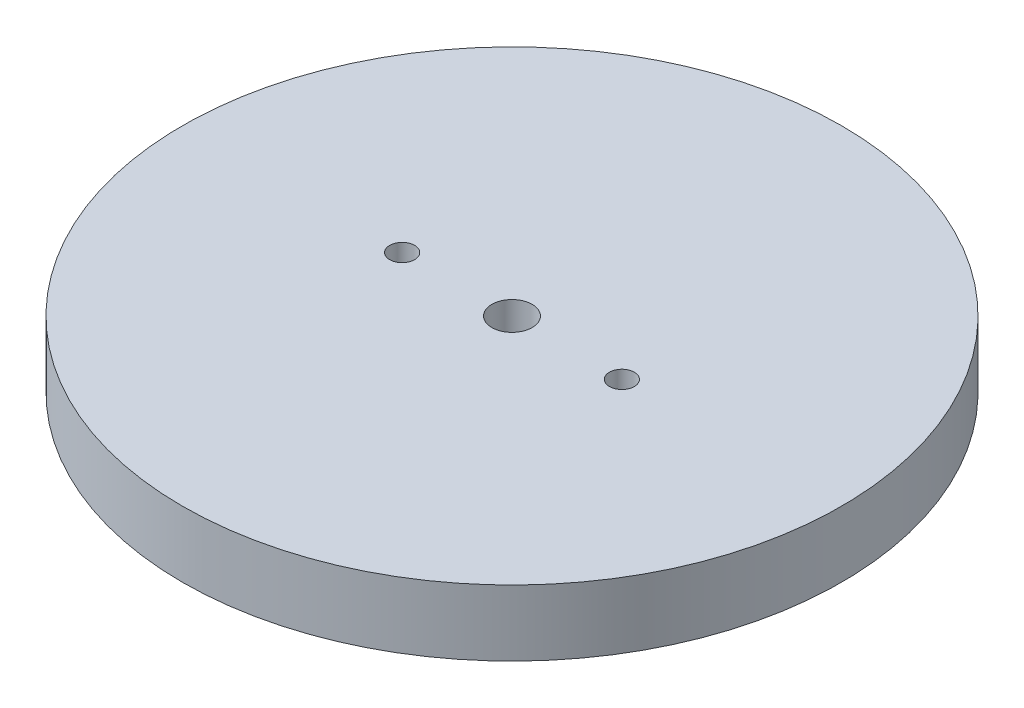
ISO-10303-21;
HEADER;
FILE_DESCRIPTION(('STEP AP214'),'2;1');
FILE_NAME('part.step','',(''),(''),'','','');
FILE_SCHEMA(('AUTOMOTIVE_DESIGN { 1 0 10303 214 1 1 1 1 }'));
ENDSEC;
DATA;
#1=APPLICATION_CONTEXT('core data for automotive mechanical design processes');
#2=APPLICATION_PROTOCOL_DEFINITION('international standard','automotive_design',2000,#1);
#3=PRODUCT_CONTEXT('',#1,'mechanical');
#4=PRODUCT('Part','Part','',(#3));
#5=PRODUCT_RELATED_PRODUCT_CATEGORY('part','',(#4));
#6=PRODUCT_DEFINITION_FORMATION('','',#4);
#7=PRODUCT_DEFINITION_CONTEXT('part definition',#1,'design');
#8=PRODUCT_DEFINITION('design','',#6,#7);
#9=PRODUCT_DEFINITION_SHAPE('','',#8);
#10=(LENGTH_UNIT() NAMED_UNIT(*) SI_UNIT(.MILLI.,.METRE.));
#11=(NAMED_UNIT(*) PLANE_ANGLE_UNIT() SI_UNIT($,.RADIAN.));
#12=(NAMED_UNIT(*) SI_UNIT($,.STERADIAN.) SOLID_ANGLE_UNIT());
#13=UNCERTAINTY_MEASURE_WITH_UNIT(LENGTH_MEASURE(1.E-05),#10,'distance_accuracy_value','');
#14=(GEOMETRIC_REPRESENTATION_CONTEXT(3) GLOBAL_UNCERTAINTY_ASSIGNED_CONTEXT((#13)) GLOBAL_UNIT_ASSIGNED_CONTEXT((#10,
#11,#12)) REPRESENTATION_CONTEXT('',''));
#15=CARTESIAN_POINT('',(0.,0.,0.));
#16=DIRECTION('',(0.,0.,1.));
#17=DIRECTION('',(1.,0.,0.));
#18=AXIS2_PLACEMENT_3D('',#15,#16,#17);
#19=CARTESIAN_POINT('',(-24.4835058402521,9.,19.1453419828918));
#20=DIRECTION('',(0.,1.,0.));
#21=DIRECTION('',(0.,0.,1.));
#22=AXIS2_PLACEMENT_3D('',#19,#20,#21);
#23=PLANE('',#22);
#24=CARTESIAN_POINT('',(-39.4835058402521,9.,19.1453419828918));
#25=DIRECTION('',(0.,1.,0.));
#26=DIRECTION('',(0.,0.,1.));
#27=AXIS2_PLACEMENT_3D('',#24,#25,#26);
#28=CIRCLE('',#27,1.7);
#29=CARTESIAN_POINT('',(-39.4835058402521,9.,20.8453419828917));
#30=VERTEX_POINT('',#29);
#31=EDGE_CURVE('E47',#30,#30,#28,.T.);
#32=ORIENTED_EDGE('',*,*,#31,.F.);
#33=EDGE_LOOP('',(#32));
#34=FACE_BOUND('',#33,.T.);
#35=CARTESIAN_POINT('',(-24.4835058402521,9.,19.1453419828918));
#36=DIRECTION('',(0.,1.,0.));
#37=DIRECTION('',(0.,0.,1.));
#38=AXIS2_PLACEMENT_3D('',#35,#36,#37);
#39=CIRCLE('',#38,45.);
#40=CARTESIAN_POINT('',(-24.4835058402521,9.,64.1453419828918));
#41=VERTEX_POINT('',#40);
#42=EDGE_CURVE('E10',#41,#41,#39,.T.);
#43=ORIENTED_EDGE('',*,*,#42,.T.);
#44=EDGE_LOOP('',(#43));
#45=FACE_BOUND('',#44,.T.);
#46=CARTESIAN_POINT('',(-24.4835058402521,9.,19.1453419828918));
#47=DIRECTION('',(0.,1.,0.));
#48=DIRECTION('',(0.,0.,1.));
#49=AXIS2_PLACEMENT_3D('',#46,#47,#48);
#50=CIRCLE('',#49,2.75);
#51=CARTESIAN_POINT('',(-24.4835058402521,9.,21.8953419828918));
#52=VERTEX_POINT('',#51);
#53=EDGE_CURVE('E42',#52,#52,#50,.T.);
#54=ORIENTED_EDGE('',*,*,#53,.F.);
#55=EDGE_LOOP('',(#54));
#56=FACE_BOUND('',#55,.T.);
#57=CARTESIAN_POINT('',(-9.48350584025207,9.,19.1453419828918));
#58=DIRECTION('',(0.,1.,0.));
#59=DIRECTION('',(0.,0.,1.));
#60=AXIS2_PLACEMENT_3D('',#57,#58,#59);
#61=CIRCLE('',#60,1.7);
#62=CARTESIAN_POINT('',(-9.48350584025207,9.,20.8453419828917));
#63=VERTEX_POINT('',#62);
#64=EDGE_CURVE('E53',#63,#63,#61,.T.);
#65=ORIENTED_EDGE('',*,*,#64,.F.);
#66=EDGE_LOOP('',(#65));
#67=FACE_BOUND('',#66,.T.);
#68=ADVANCED_FACE('F31',(#34,#45,#56,#67),#23,.T.);
#69=CARTESIAN_POINT('',(-24.4835058402521,0.,19.1453419828918));
#70=DIRECTION('',(0.,1.,0.));
#71=DIRECTION('',(0.,0.,1.));
#72=AXIS2_PLACEMENT_3D('',#69,#70,#71);
#73=PLANE('',#72);
#74=CARTESIAN_POINT('',(-24.4835058402521,0.,19.1453419828918));
#75=DIRECTION('',(0.,1.,0.));
#76=DIRECTION('',(0.,0.,1.));
#77=AXIS2_PLACEMENT_3D('',#74,#75,#76);
#78=CIRCLE('',#77,45.);
#79=CARTESIAN_POINT('',(-24.4835058402521,0.,64.1453419828918));
#80=VERTEX_POINT('',#79);
#81=EDGE_CURVE('E35',#80,#80,#78,.T.);
#82=ORIENTED_EDGE('',*,*,#81,.F.);
#83=EDGE_LOOP('',(#82));
#84=FACE_BOUND('',#83,.T.);
#85=CARTESIAN_POINT('',(-24.4835058402521,0.,19.1453419828918));
#86=DIRECTION('',(0.,1.,0.));
#87=DIRECTION('',(0.,0.,1.));
#88=AXIS2_PLACEMENT_3D('',#85,#86,#87);
#89=CIRCLE('',#88,2.75);
#90=CARTESIAN_POINT('',(-24.4835058402521,0.,21.8953419828918));
#91=VERTEX_POINT('',#90);
#92=EDGE_CURVE('E44',#91,#91,#89,.T.);
#93=ORIENTED_EDGE('',*,*,#92,.T.);
#94=EDGE_LOOP('',(#93));
#95=FACE_BOUND('',#94,.T.);
#96=CARTESIAN_POINT('',(-39.4835058402521,0.,19.1453419828918));
#97=DIRECTION('',(0.,1.,0.));
#98=DIRECTION('',(0.,0.,1.));
#99=AXIS2_PLACEMENT_3D('',#96,#97,#98);
#100=CIRCLE('',#99,1.7);
#101=CARTESIAN_POINT('',(-39.4835058402521,0.,20.8453419828917));
#102=VERTEX_POINT('',#101);
#103=EDGE_CURVE('E50',#102,#102,#100,.T.);
#104=ORIENTED_EDGE('',*,*,#103,.T.);
#105=EDGE_LOOP('',(#104));
#106=FACE_BOUND('',#105,.T.);
#107=CARTESIAN_POINT('',(-9.48350584025207,0.,19.1453419828918));
#108=DIRECTION('',(0.,1.,0.));
#109=DIRECTION('',(0.,0.,1.));
#110=AXIS2_PLACEMENT_3D('',#107,#108,#109);
#111=CIRCLE('',#110,1.7);
#112=CARTESIAN_POINT('',(-9.48350584025207,0.,20.8453419828917));
#113=VERTEX_POINT('',#112);
#114=EDGE_CURVE('E56',#113,#113,#111,.T.);
#115=ORIENTED_EDGE('',*,*,#114,.T.);
#116=EDGE_LOOP('',(#115));
#117=FACE_BOUND('',#116,.T.);
#118=ADVANCED_FACE('F66',(#84,#95,#106,#117),#73,.F.);
#119=CARTESIAN_POINT('',(-24.4835058402521,9.,19.1453419828918));
#120=DIRECTION('',(0.,-1.,0.));
#121=DIRECTION('',(0.,0.,-1.));
#122=AXIS2_PLACEMENT_3D('',#119,#120,#121);
#123=CYLINDRICAL_SURFACE('',#122,45.);
#124=ORIENTED_EDGE('',*,*,#42,.F.);
#125=EDGE_LOOP('',(#124));
#126=FACE_BOUND('',#125,.T.);
#127=ORIENTED_EDGE('',*,*,#81,.T.);
#128=EDGE_LOOP('',(#127));
#129=FACE_BOUND('',#128,.T.);
#130=ADVANCED_FACE('F33',(#126,#129),#123,.T.);
#131=CARTESIAN_POINT('',(-24.4835058402521,9.,19.1453419828918));
#132=DIRECTION('',(0.,-1.,0.));
#133=DIRECTION('',(0.,0.,-1.));
#134=AXIS2_PLACEMENT_3D('',#131,#132,#133);
#135=CYLINDRICAL_SURFACE('',#134,2.75);
#136=ORIENTED_EDGE('',*,*,#53,.T.);
#137=EDGE_LOOP('',(#136));
#138=FACE_BOUND('',#137,.T.);
#139=ORIENTED_EDGE('',*,*,#92,.F.);
#140=EDGE_LOOP('',(#139));
#141=FACE_BOUND('',#140,.T.);
#142=ADVANCED_FACE('F75',(#138,#141),#135,.F.);
#143=CARTESIAN_POINT('',(-39.4835058402521,9.,19.1453419828918));
#144=DIRECTION('',(0.,-1.,0.));
#145=DIRECTION('',(0.,0.,-1.));
#146=AXIS2_PLACEMENT_3D('',#143,#144,#145);
#147=CYLINDRICAL_SURFACE('',#146,1.7);
#148=ORIENTED_EDGE('',*,*,#31,.T.);
#149=EDGE_LOOP('',(#148));
#150=FACE_BOUND('',#149,.T.);
#151=ORIENTED_EDGE('',*,*,#103,.F.);
#152=EDGE_LOOP('',(#151));
#153=FACE_BOUND('',#152,.T.);
#154=ADVANCED_FACE('F78',(#150,#153),#147,.F.);
#155=CARTESIAN_POINT('',(-9.48350584025207,9.,19.1453419828918));
#156=DIRECTION('',(0.,-1.,0.));
#157=DIRECTION('',(0.,0.,-1.));
#158=AXIS2_PLACEMENT_3D('',#155,#156,#157);
#159=CYLINDRICAL_SURFACE('',#158,1.7);
#160=ORIENTED_EDGE('',*,*,#64,.T.);
#161=EDGE_LOOP('',(#160));
#162=FACE_BOUND('',#161,.T.);
#163=ORIENTED_EDGE('',*,*,#114,.F.);
#164=EDGE_LOOP('',(#163));
#165=FACE_BOUND('',#164,.T.);
#166=ADVANCED_FACE('F62',(#162,#165),#159,.F.);
#167=CLOSED_SHELL('',(#68,#118,#130,#142,#154,#166));
#168=MANIFOLD_SOLID_BREP('B2',#167);
#169=ADVANCED_BREP_SHAPE_REPRESENTATION('',(#18,#168),#14);
#170=SHAPE_DEFINITION_REPRESENTATION(#9,#169);
ENDSEC;
END-ISO-10303-21;
